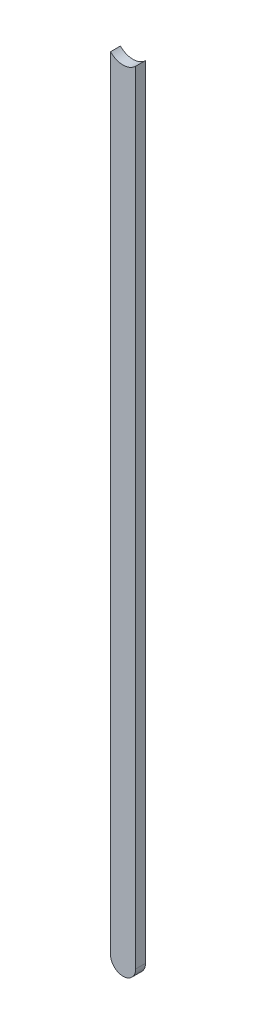
ISO-10303-21;
HEADER;
FILE_DESCRIPTION(('STEP AP214'),'2;1');
FILE_NAME('part.step','',(''),(''),'','','');
FILE_SCHEMA(('AUTOMOTIVE_DESIGN { 1 0 10303 214 1 1 1 1 }'));
ENDSEC;
DATA;
#1=APPLICATION_CONTEXT('core data for automotive mechanical design processes');
#2=APPLICATION_PROTOCOL_DEFINITION('international standard','automotive_design',2000,#1);
#3=PRODUCT_CONTEXT('',#1,'mechanical');
#4=PRODUCT('Part','Part','',(#3));
#5=PRODUCT_RELATED_PRODUCT_CATEGORY('part','',(#4));
#6=PRODUCT_DEFINITION_FORMATION('','',#4);
#7=PRODUCT_DEFINITION_CONTEXT('part definition',#1,'design');
#8=PRODUCT_DEFINITION('design','',#6,#7);
#9=PRODUCT_DEFINITION_SHAPE('','',#8);
#10=(LENGTH_UNIT() NAMED_UNIT(*) SI_UNIT(.MILLI.,.METRE.));
#11=(NAMED_UNIT(*) PLANE_ANGLE_UNIT() SI_UNIT($,.RADIAN.));
#12=(NAMED_UNIT(*) SI_UNIT($,.STERADIAN.) SOLID_ANGLE_UNIT());
#13=UNCERTAINTY_MEASURE_WITH_UNIT(LENGTH_MEASURE(1.E-05),#10,'distance_accuracy_value','');
#14=(GEOMETRIC_REPRESENTATION_CONTEXT(3) GLOBAL_UNCERTAINTY_ASSIGNED_CONTEXT((#13)) GLOBAL_UNIT_ASSIGNED_CONTEXT((#10,
#11,#12)) REPRESENTATION_CONTEXT('',''));
#15=CARTESIAN_POINT('',(0.,0.,0.));
#16=DIRECTION('',(0.,0.,1.));
#17=DIRECTION('',(1.,0.,0.));
#18=AXIS2_PLACEMENT_3D('',#15,#16,#17);
#19=CARTESIAN_POINT('',(87.63,92.51763056,0.));
#20=DIRECTION('',(-1.,0.,0.));
#21=DIRECTION('',(0.,1.,0.));
#22=AXIS2_PLACEMENT_3D('',#19,#20,#21);
#23=PLANE('',#22);
#24=DIRECTION('',(0.,1.,0.));
#25=VECTOR('',#24,1.);
#26=CARTESIAN_POINT('',(87.63,92.51763056,0.1999996));
#27=LINE('',#26,#25);
#28=CARTESIAN_POINT('',(87.63,92.51763056,0.1999996));
#29=VERTEX_POINT('',#28);
#30=CARTESIAN_POINT('',(87.63,108.336131842133,0.1999996));
#31=VERTEX_POINT('',#30);
#32=EDGE_CURVE('E11',#29,#31,#27,.T.);
#33=ORIENTED_EDGE('',*,*,#32,.F.);
#34=DIRECTION('',(0.,0.,1.));
#35=VECTOR('',#34,1.);
#36=CARTESIAN_POINT('',(87.63,92.51763056,0.));
#37=LINE('',#36,#35);
#38=CARTESIAN_POINT('',(87.63,92.51763056,0.));
#39=VERTEX_POINT('',#38);
#40=EDGE_CURVE('E24',#39,#29,#37,.T.);
#41=ORIENTED_EDGE('',*,*,#40,.F.);
#42=DIRECTION('',(0.,1.,0.));
#43=VECTOR('',#42,1.);
#44=CARTESIAN_POINT('',(87.63,92.51763056,0.));
#45=LINE('',#44,#43);
#46=CARTESIAN_POINT('',(87.63,108.336131842133,0.));
#47=VERTEX_POINT('',#46);
#48=EDGE_CURVE('E75',#39,#47,#45,.T.);
#49=ORIENTED_EDGE('',*,*,#48,.T.);
#50=DIRECTION('',(0.,0.,1.));
#51=VECTOR('',#50,1.);
#52=CARTESIAN_POINT('',(87.63,108.336131842133,0.));
#53=LINE('',#52,#51);
#54=EDGE_CURVE('E37',#47,#31,#53,.T.);
#55=ORIENTED_EDGE('',*,*,#54,.T.);
#56=EDGE_LOOP('',(#33,#41,#49,#55));
#57=FACE_BOUND('',#56,.T.);
#58=ADVANCED_FACE('F17',(#57),#23,.F.);
#59=CARTESIAN_POINT('',(87.376,108.585,0.));
#60=DIRECTION('',(0.,0.,-1.));
#61=DIRECTION('',(1.,0.,0.));
#62=AXIS2_PLACEMENT_3D('',#59,#60,#61);
#63=CYLINDRICAL_SURFACE('',#62,0.3556);
#64=DIRECTION('',(0.,0.,1.));
#65=VECTOR('',#64,1.);
#66=CARTESIAN_POINT('',(87.122,108.336131842133,0.));
#67=LINE('',#66,#65);
#68=CARTESIAN_POINT('',(87.122,108.336131842133,0.));
#69=VERTEX_POINT('',#68);
#70=CARTESIAN_POINT('',(87.122,108.336131842133,0.1999996));
#71=VERTEX_POINT('',#70);
#72=EDGE_CURVE('E67',#69,#71,#67,.T.);
#73=ORIENTED_EDGE('',*,*,#72,.T.);
#74=CARTESIAN_POINT('',(87.376,108.585,0.1999996));
#75=DIRECTION('',(0.,0.,1.));
#76=DIRECTION('',(1.,0.,0.));
#77=AXIS2_PLACEMENT_3D('',#74,#75,#76);
#78=CIRCLE('',#77,0.3556);
#79=EDGE_CURVE('E82',#71,#31,#78,.T.);
#80=ORIENTED_EDGE('',*,*,#79,.T.);
#81=ORIENTED_EDGE('',*,*,#54,.F.);
#82=CARTESIAN_POINT('',(87.376,108.585,0.));
#83=DIRECTION('',(0.,0.,1.));
#84=DIRECTION('',(1.,0.,0.));
#85=AXIS2_PLACEMENT_3D('',#82,#83,#84);
#86=CIRCLE('',#85,0.3556);
#87=EDGE_CURVE('E80',#69,#47,#86,.T.);
#88=ORIENTED_EDGE('',*,*,#87,.F.);
#89=EDGE_LOOP('',(#73,#80,#81,#88));
#90=FACE_BOUND('',#89,.T.);
#91=ADVANCED_FACE('F88',(#90),#63,.F.);
#92=CARTESIAN_POINT('',(87.122,108.336131842133,0.));
#93=DIRECTION('',(1.,0.,0.));
#94=DIRECTION('',(0.,-1.,0.));
#95=AXIS2_PLACEMENT_3D('',#92,#93,#94);
#96=PLANE('',#95);
#97=DIRECTION('',(0.,-1.,0.));
#98=VECTOR('',#97,1.);
#99=CARTESIAN_POINT('',(87.122,108.585,0.1999996));
#100=LINE('',#99,#98);
#101=CARTESIAN_POINT('',(87.122,92.51763056,0.1999996));
#102=VERTEX_POINT('',#101);
#103=EDGE_CURVE('E71',#71,#102,#100,.T.);
#104=ORIENTED_EDGE('',*,*,#103,.F.);
#105=ORIENTED_EDGE('',*,*,#72,.F.);
#106=DIRECTION('',(0.,-1.,0.));
#107=VECTOR('',#106,1.);
#108=CARTESIAN_POINT('',(87.122,108.585,0.));
#109=LINE('',#108,#107);
#110=CARTESIAN_POINT('',(87.122,92.51763056,0.));
#111=VERTEX_POINT('',#110);
#112=EDGE_CURVE('E63',#69,#111,#109,.T.);
#113=ORIENTED_EDGE('',*,*,#112,.T.);
#114=DIRECTION('',(0.,0.,1.));
#115=VECTOR('',#114,1.);
#116=CARTESIAN_POINT('',(87.122,92.51763056,0.));
#117=LINE('',#116,#115);
#118=EDGE_CURVE('E53',#111,#102,#117,.T.);
#119=ORIENTED_EDGE('',*,*,#118,.T.);
#120=EDGE_LOOP('',(#104,#105,#113,#119));
#121=FACE_BOUND('',#120,.T.);
#122=ADVANCED_FACE('F66',(#121),#96,.F.);
#123=CARTESIAN_POINT('',(87.376,92.51763056,0.));
#124=DIRECTION('',(0.,0.,-1.));
#125=DIRECTION('',(-1.,0.,0.));
#126=AXIS2_PLACEMENT_3D('',#123,#124,#125);
#127=CYLINDRICAL_SURFACE('',#126,0.254);
#128=CARTESIAN_POINT('',(87.376,92.51763056,0.1999996));
#129=DIRECTION('',(0.,0.,1.));
#130=DIRECTION('',(-1.,0.,0.));
#131=AXIS2_PLACEMENT_3D('',#128,#129,#130);
#132=CIRCLE('',#131,0.254);
#133=EDGE_CURVE('E59',#102,#29,#132,.T.);
#134=ORIENTED_EDGE('',*,*,#133,.F.);
#135=ORIENTED_EDGE('',*,*,#118,.F.);
#136=CARTESIAN_POINT('',(87.376,92.51763056,0.));
#137=DIRECTION('',(0.,0.,1.));
#138=DIRECTION('',(-1.,0.,0.));
#139=AXIS2_PLACEMENT_3D('',#136,#137,#138);
#140=CIRCLE('',#139,0.254);
#141=EDGE_CURVE('E57',#111,#39,#140,.T.);
#142=ORIENTED_EDGE('',*,*,#141,.T.);
#143=ORIENTED_EDGE('',*,*,#40,.T.);
#144=EDGE_LOOP('',(#134,#135,#142,#143));
#145=FACE_BOUND('',#144,.T.);
#146=ADVANCED_FACE('F55',(#145),#127,.T.);
#147=CARTESIAN_POINT('',(87.63,92.51763056,0.));
#148=DIRECTION('',(0.,0.,-1.));
#149=DIRECTION('',(-1.,0.,0.));
#150=AXIS2_PLACEMENT_3D('',#147,#148,#149);
#151=PLANE('',#150);
#152=ORIENTED_EDGE('',*,*,#48,.F.);
#153=ORIENTED_EDGE('',*,*,#141,.F.);
#154=ORIENTED_EDGE('',*,*,#112,.F.);
#155=ORIENTED_EDGE('',*,*,#87,.T.);
#156=EDGE_LOOP('',(#152,#153,#154,#155));
#157=FACE_BOUND('',#156,.T.);
#158=ADVANCED_FACE('F74',(#157),#151,.T.);
#159=CARTESIAN_POINT('',(87.63,92.51763056,0.1999996));
#160=DIRECTION('',(0.,0.,-1.));
#161=DIRECTION('',(-1.,0.,0.));
#162=AXIS2_PLACEMENT_3D('',#159,#160,#161);
#163=PLANE('',#162);
#164=ORIENTED_EDGE('',*,*,#133,.T.);
#165=ORIENTED_EDGE('',*,*,#32,.T.);
#166=ORIENTED_EDGE('',*,*,#79,.F.);
#167=ORIENTED_EDGE('',*,*,#103,.T.);
#168=EDGE_LOOP('',(#164,#165,#166,#167));
#169=FACE_BOUND('',#168,.T.);
#170=ADVANCED_FACE('F91',(#169),#163,.F.);
#171=CLOSED_SHELL('',(#58,#91,#122,#146,#158,#170));
#172=MANIFOLD_SOLID_BREP('B1',#171);
#173=ADVANCED_BREP_SHAPE_REPRESENTATION('',(#18,#172),#14);
#174=SHAPE_DEFINITION_REPRESENTATION(#9,#173);
ENDSEC;
END-ISO-10303-21;
